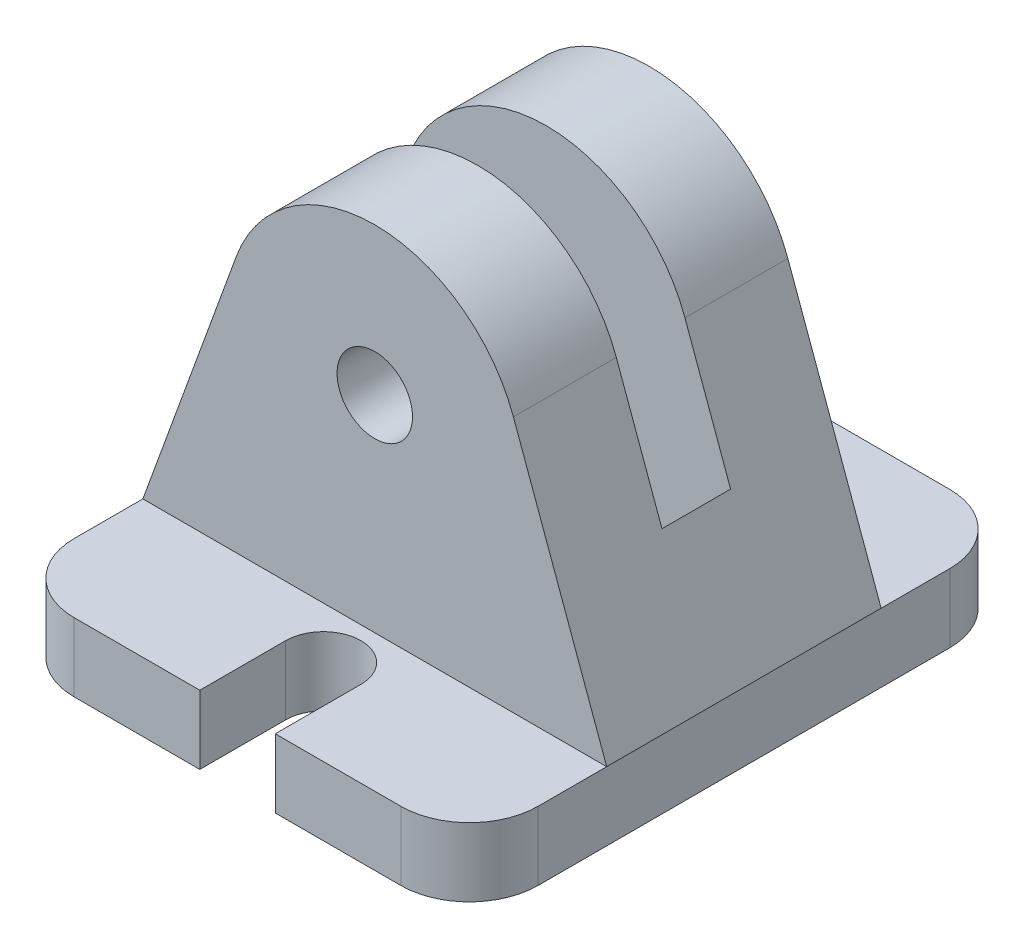
ISO-10303-21;
HEADER;
FILE_DESCRIPTION(('STEP AP214'),'2;1');
FILE_NAME('part.step','',(''),(''),'','','');
FILE_SCHEMA(('AUTOMOTIVE_DESIGN { 1 0 10303 214 1 1 1 1 }'));
ENDSEC;
DATA;
#1=APPLICATION_CONTEXT('core data for automotive mechanical design processes');
#2=APPLICATION_PROTOCOL_DEFINITION('international standard','automotive_design',2000,#1);
#3=PRODUCT_CONTEXT('',#1,'mechanical');
#4=PRODUCT('Part','Part','',(#3));
#5=PRODUCT_RELATED_PRODUCT_CATEGORY('part','',(#4));
#6=PRODUCT_DEFINITION_FORMATION('','',#4);
#7=PRODUCT_DEFINITION_CONTEXT('part definition',#1,'design');
#8=PRODUCT_DEFINITION('design','',#6,#7);
#9=PRODUCT_DEFINITION_SHAPE('','',#8);
#10=(LENGTH_UNIT() NAMED_UNIT(*) SI_UNIT(.MILLI.,.METRE.));
#11=(NAMED_UNIT(*) PLANE_ANGLE_UNIT() SI_UNIT($,.RADIAN.));
#12=(NAMED_UNIT(*) SI_UNIT($,.STERADIAN.) SOLID_ANGLE_UNIT());
#13=UNCERTAINTY_MEASURE_WITH_UNIT(LENGTH_MEASURE(1.E-05),#10,'distance_accuracy_value','');
#14=(GEOMETRIC_REPRESENTATION_CONTEXT(3) GLOBAL_UNCERTAINTY_ASSIGNED_CONTEXT((#13)) GLOBAL_UNIT_ASSIGNED_CONTEXT((#10,
#11,#12)) REPRESENTATION_CONTEXT('',''));
#15=CARTESIAN_POINT('',(0.,0.,0.));
#16=DIRECTION('',(0.,0.,1.));
#17=DIRECTION('',(1.,0.,0.));
#18=AXIS2_PLACEMENT_3D('',#15,#16,#17);
#19=CARTESIAN_POINT('',(-10.1016956734485,3.67671654075095,10.));
#20=DIRECTION('',(0.939692620785908,-0.342020143325669,0.));
#21=DIRECTION('',(0.342020143325669,0.939692620785908,0.));
#22=AXIS2_PLACEMENT_3D('',#19,#20,#21);
#23=PLANE('',#22);
#24=DIRECTION('',(0.,0.,-1.));
#25=VECTOR('',#24,1.);
#26=CARTESIAN_POINT('',(-16.8994645681091,-15.,10.));
#27=LINE('',#26,#25);
#28=CARTESIAN_POINT('',(-16.8994645681091,-15.,-2.5));
#29=VERTEX_POINT('',#28);
#30=CARTESIAN_POINT('',(-16.8994645681091,-15.,-10.));
#31=VERTEX_POINT('',#30);
#32=EDGE_CURVE('E38',#29,#31,#27,.T.);
#33=ORIENTED_EDGE('',*,*,#32,.F.);
#34=DIRECTION('',(-0.342020143325669,-0.939692620785908,0.));
#35=VECTOR('',#34,1.);
#36=CARTESIAN_POINT('',(-10.1016956734485,3.67671654075095,-2.5));
#37=LINE('',#36,#35);
#38=CARTESIAN_POINT('',(-10.1016956734485,3.67671654075095,-2.5));
#39=VERTEX_POINT('',#38);
#40=EDGE_CURVE('E259',#39,#29,#37,.T.);
#41=ORIENTED_EDGE('',*,*,#40,.F.);
#42=DIRECTION('',(0.,0.,-1.));
#43=VECTOR('',#42,1.);
#44=CARTESIAN_POINT('',(-10.1016956734485,3.67671654075095,10.));
#45=LINE('',#44,#43);
#46=CARTESIAN_POINT('',(-10.1016956734485,3.67671654075095,-10.));
#47=VERTEX_POINT('',#46);
#48=EDGE_CURVE('E299',#39,#47,#45,.T.);
#49=ORIENTED_EDGE('',*,*,#48,.T.);
#50=DIRECTION('',(-0.342020143325669,-0.939692620785908,0.));
#51=VECTOR('',#50,1.);
#52=CARTESIAN_POINT('',(-10.1016956734485,3.67671654075095,-10.));
#53=LINE('',#52,#51);
#54=EDGE_CURVE('E302',#47,#31,#53,.T.);
#55=ORIENTED_EDGE('',*,*,#54,.T.);
#56=EDGE_LOOP('',(#33,#41,#49,#55));
#57=FACE_BOUND('',#56,.T.);
#58=ADVANCED_FACE('F34',(#57),#23,.F.);
#59=CARTESIAN_POINT('',(0.,0.,-2.5));
#60=DIRECTION('',(0.,0.,1.));
#61=DIRECTION('',(1.,0.,0.));
#62=AXIS2_PLACEMENT_3D('',#59,#60,#61);
#63=CYLINDRICAL_SURFACE('',#62,14.5);
#64=DIRECTION('',(0.,0.,1.));
#65=VECTOR('',#64,1.);
#66=CARTESIAN_POINT('',(10.2530483272049,-10.253048327205,-2.5));
#67=LINE('',#66,#65);
#68=CARTESIAN_POINT('',(10.2530483272049,-10.253048327205,-2.5));
#69=VERTEX_POINT('',#68);
#70=CARTESIAN_POINT('',(10.2530483272049,-10.253048327205,2.5));
#71=VERTEX_POINT('',#70);
#72=EDGE_CURVE('E223',#69,#71,#67,.T.);
#73=ORIENTED_EDGE('',*,*,#72,.T.);
#74=CARTESIAN_POINT('',(0.,0.,2.5));
#75=DIRECTION('',(0.,0.,1.));
#76=DIRECTION('',(1.,0.,0.));
#77=AXIS2_PLACEMENT_3D('',#74,#75,#76);
#78=CIRCLE('',#77,14.5);
#79=CARTESIAN_POINT('',(13.4298082611003,-5.46719764322486,2.5));
#80=VERTEX_POINT('',#79);
#81=EDGE_CURVE('E235',#71,#80,#78,.T.);
#82=ORIENTED_EDGE('',*,*,#81,.T.);
#83=DIRECTION('',(0.,0.,1.));
#84=VECTOR('',#83,1.);
#85=CARTESIAN_POINT('',(13.4298082611003,-5.46719764322486,-2.5));
#86=LINE('',#85,#84);
#87=CARTESIAN_POINT('',(13.4298082611003,-5.46719764322486,-2.5));
#88=VERTEX_POINT('',#87);
#89=EDGE_CURVE('E232',#88,#80,#86,.T.);
#90=ORIENTED_EDGE('',*,*,#89,.F.);
#91=CARTESIAN_POINT('',(0.,0.,-2.5));
#92=DIRECTION('',(0.,0.,1.));
#93=DIRECTION('',(1.,0.,0.));
#94=AXIS2_PLACEMENT_3D('',#91,#92,#93);
#95=CIRCLE('',#94,14.5);
#96=EDGE_CURVE('E219',#69,#88,#95,.T.);
#97=ORIENTED_EDGE('',*,*,#96,.F.);
#98=EDGE_LOOP('',(#73,#82,#90,#97));
#99=FACE_BOUND('',#98,.T.);
#100=ADVANCED_FACE('F230',(#99),#63,.F.);
#101=CARTESIAN_POINT('',(-16.8994645681091,-20.,0.));
#102=DIRECTION('',(-1.,0.,0.));
#103=DIRECTION('',(0.,-1.,0.));
#104=AXIS2_PLACEMENT_3D('',#101,#102,#103);
#105=PLANE('',#104);
#106=DIRECTION('',(0.,0.,1.));
#107=VECTOR('',#106,1.);
#108=CARTESIAN_POINT('',(-16.8994645681091,-20.,0.));
#109=LINE('',#108,#107);
#110=CARTESIAN_POINT('',(-16.8994645681091,-20.,-15.));
#111=VERTEX_POINT('',#110);
#112=CARTESIAN_POINT('',(-16.8994645681091,-20.,-2.5));
#113=VERTEX_POINT('',#112);
#114=EDGE_CURVE('E407',#111,#113,#109,.T.);
#115=ORIENTED_EDGE('',*,*,#114,.T.);
#116=DIRECTION('',(0.,1.,0.));
#117=VECTOR('',#116,1.);
#118=CARTESIAN_POINT('',(-16.8994645681091,-20.,-2.5));
#119=LINE('',#118,#117);
#120=EDGE_CURVE('E367',#113,#29,#119,.T.);
#121=ORIENTED_EDGE('',*,*,#120,.T.);
#122=ORIENTED_EDGE('',*,*,#32,.T.);
#123=DIRECTION('',(0.,0.,1.));
#124=VECTOR('',#123,1.);
#125=CARTESIAN_POINT('',(-16.8994645681091,-15.,0.));
#126=LINE('',#125,#124);
#127=CARTESIAN_POINT('',(-16.8994645681091,-15.,-15.));
#128=VERTEX_POINT('',#127);
#129=EDGE_CURVE('E376',#128,#31,#126,.T.);
#130=ORIENTED_EDGE('',*,*,#129,.F.);
#131=DIRECTION('',(0.,1.,0.));
#132=VECTOR('',#131,1.);
#133=CARTESIAN_POINT('',(-16.8994645681091,-20.,-15.));
#134=LINE('',#133,#132);
#135=EDGE_CURVE('E471',#111,#128,#134,.T.);
#136=ORIENTED_EDGE('',*,*,#135,.F.);
#137=EDGE_LOOP('',(#115,#121,#122,#130,#136));
#138=FACE_BOUND('',#137,.T.);
#139=ADVANCED_FACE('F343',(#138),#105,.T.);
#140=CARTESIAN_POINT('',(0.,-20.,0.));
#141=DIRECTION('',(0.,-1.,0.));
#142=DIRECTION('',(1.,0.,0.));
#143=AXIS2_PLACEMENT_3D('',#140,#141,#142);
#144=PLANE('',#143);
#145=DIRECTION('',(0.,0.,1.));
#146=VECTOR('',#145,1.);
#147=CARTESIAN_POINT('',(0.506096654409785,-20.,0.));
#148=LINE('',#147,#146);
#149=CARTESIAN_POINT('',(0.506096654409784,-20.,-2.5));
#150=VERTEX_POINT('',#149);
#151=CARTESIAN_POINT('',(0.506096654409784,-20.,2.5));
#152=VERTEX_POINT('',#151);
#153=EDGE_CURVE('E44',#150,#152,#148,.T.);
#154=ORIENTED_EDGE('',*,*,#153,.F.);
#155=DIRECTION('',(-1.,0.,0.));
#156=VECTOR('',#155,1.);
#157=CARTESIAN_POINT('',(0.,-20.,-2.5));
#158=LINE('',#157,#156);
#159=EDGE_CURVE('E11',#150,#113,#158,.T.);
#160=ORIENTED_EDGE('',*,*,#159,.T.);
#161=ORIENTED_EDGE('',*,*,#114,.F.);
#162=CARTESIAN_POINT('',(-11.8994645681091,-20.,-15.));
#163=DIRECTION('',(0.,-1.,0.));
#164=DIRECTION('',(1.,0.,0.));
#165=AXIS2_PLACEMENT_3D('',#162,#163,#164);
#166=CIRCLE('',#165,5.);
#167=CARTESIAN_POINT('',(-11.8994645681091,-20.,-20.));
#168=VERTEX_POINT('',#167);
#169=EDGE_CURVE('E410',#111,#168,#166,.T.);
#170=ORIENTED_EDGE('',*,*,#169,.T.);
#171=DIRECTION('',(1.,0.,0.));
#172=VECTOR('',#171,1.);
#173=CARTESIAN_POINT('',(0.,-20.,-20.));
#174=LINE('',#173,#172);
#175=CARTESIAN_POINT('',(-2.75,-20.,-20.));
#176=VERTEX_POINT('',#175);
#177=EDGE_CURVE('E417',#168,#176,#174,.T.);
#178=ORIENTED_EDGE('',*,*,#177,.T.);
#179=DIRECTION('',(0.,0.,-1.));
#180=VECTOR('',#179,1.);
#181=CARTESIAN_POINT('',(-2.75,-20.,-20.));
#182=LINE('',#181,#180);
#183=CARTESIAN_POINT('',(-2.75,-20.,-13.75));
#184=VERTEX_POINT('',#183);
#185=EDGE_CURVE('E617',#184,#176,#182,.T.);
#186=ORIENTED_EDGE('',*,*,#185,.F.);
#187=CARTESIAN_POINT('',(0.,-20.,-13.75));
#188=DIRECTION('',(0.,-1.,0.));
#189=DIRECTION('',(-1.,0.,0.));
#190=AXIS2_PLACEMENT_3D('',#187,#188,#189);
#191=CIRCLE('',#190,2.75);
#192=CARTESIAN_POINT('',(2.75,-20.,-13.75));
#193=VERTEX_POINT('',#192);
#194=EDGE_CURVE('E59',#193,#184,#191,.T.);
#195=ORIENTED_EDGE('',*,*,#194,.F.);
#196=DIRECTION('',(0.,0.,1.));
#197=VECTOR('',#196,1.);
#198=CARTESIAN_POINT('',(2.75,-20.,-13.75));
#199=LINE('',#198,#197);
#200=CARTESIAN_POINT('',(2.75,-20.,-20.));
#201=VERTEX_POINT('',#200);
#202=EDGE_CURVE('E521',#201,#193,#199,.T.);
#203=ORIENTED_EDGE('',*,*,#202,.F.);
#204=CARTESIAN_POINT('',(11.8994645681091,-20.,-20.));
#205=VERTEX_POINT('',#204);
#206=EDGE_CURVE('E416',#201,#205,#174,.T.);
#207=ORIENTED_EDGE('',*,*,#206,.T.);
#208=CARTESIAN_POINT('',(11.8994645681091,-20.,-15.));
#209=DIRECTION('',(0.,-1.,0.));
#210=DIRECTION('',(1.,0.,0.));
#211=AXIS2_PLACEMENT_3D('',#208,#209,#210);
#212=CIRCLE('',#211,5.);
#213=CARTESIAN_POINT('',(16.8994645681091,-20.,-15.));
#214=VERTEX_POINT('',#213);
#215=EDGE_CURVE('E420',#205,#214,#212,.T.);
#216=ORIENTED_EDGE('',*,*,#215,.T.);
#217=DIRECTION('',(0.,0.,1.));
#218=VECTOR('',#217,1.);
#219=CARTESIAN_POINT('',(16.8994645681091,-20.,0.));
#220=LINE('',#219,#218);
#221=CARTESIAN_POINT('',(16.8994645681091,-20.,15.));
#222=VERTEX_POINT('',#221);
#223=EDGE_CURVE('E422',#214,#222,#220,.T.);
#224=ORIENTED_EDGE('',*,*,#223,.T.);
#225=CARTESIAN_POINT('',(11.8994645681091,-20.,15.));
#226=DIRECTION('',(0.,-1.,0.));
#227=DIRECTION('',(1.,0.,0.));
#228=AXIS2_PLACEMENT_3D('',#225,#226,#227);
#229=CIRCLE('',#228,5.);
#230=CARTESIAN_POINT('',(11.8994645681091,-20.,20.));
#231=VERTEX_POINT('',#230);
#232=EDGE_CURVE('E424',#231,#222,#229,.F.);
#233=ORIENTED_EDGE('',*,*,#232,.F.);
#234=DIRECTION('',(1.,0.,0.));
#235=VECTOR('',#234,1.);
#236=CARTESIAN_POINT('',(0.,-20.,20.));
#237=LINE('',#236,#235);
#238=CARTESIAN_POINT('',(2.75,-20.,20.));
#239=VERTEX_POINT('',#238);
#240=EDGE_CURVE('E427',#239,#231,#237,.T.);
#241=ORIENTED_EDGE('',*,*,#240,.F.);
#242=DIRECTION('',(0.,0.,1.));
#243=VECTOR('',#242,1.);
#244=CARTESIAN_POINT('',(2.75,-20.,13.75));
#245=LINE('',#244,#243);
#246=CARTESIAN_POINT('',(2.75,-20.,13.75));
#247=VERTEX_POINT('',#246);
#248=EDGE_CURVE('E539',#247,#239,#245,.T.);
#249=ORIENTED_EDGE('',*,*,#248,.F.);
#250=CARTESIAN_POINT('',(0.,-20.,13.75));
#251=DIRECTION('',(0.,-1.,0.));
#252=DIRECTION('',(1.,0.,0.));
#253=AXIS2_PLACEMENT_3D('',#250,#251,#252);
#254=CIRCLE('',#253,2.75);
#255=CARTESIAN_POINT('',(-2.75,-20.,13.75));
#256=VERTEX_POINT('',#255);
#257=EDGE_CURVE('E536',#256,#247,#254,.T.);
#258=ORIENTED_EDGE('',*,*,#257,.F.);
#259=DIRECTION('',(0.,0.,-1.));
#260=VECTOR('',#259,1.);
#261=CARTESIAN_POINT('',(-2.75,-20.,20.));
#262=LINE('',#261,#260);
#263=CARTESIAN_POINT('',(-2.75,-20.,20.));
#264=VERTEX_POINT('',#263);
#265=EDGE_CURVE('E533',#264,#256,#262,.T.);
#266=ORIENTED_EDGE('',*,*,#265,.F.);
#267=CARTESIAN_POINT('',(-11.8994645681091,-20.,20.));
#268=VERTEX_POINT('',#267);
#269=EDGE_CURVE('E428',#268,#264,#237,.T.);
#270=ORIENTED_EDGE('',*,*,#269,.F.);
#271=CARTESIAN_POINT('',(-11.8994645681091,-20.,15.));
#272=DIRECTION('',(0.,-1.,0.));
#273=DIRECTION('',(1.,0.,0.));
#274=AXIS2_PLACEMENT_3D('',#271,#272,#273);
#275=CIRCLE('',#274,5.);
#276=CARTESIAN_POINT('',(-16.8994645681091,-20.,15.));
#277=VERTEX_POINT('',#276);
#278=EDGE_CURVE('E406',#277,#268,#275,.F.);
#279=ORIENTED_EDGE('',*,*,#278,.F.);
#280=CARTESIAN_POINT('',(-16.8994645681091,-20.,2.5));
#281=VERTEX_POINT('',#280);
#282=EDGE_CURVE('E403',#281,#277,#109,.T.);
#283=ORIENTED_EDGE('',*,*,#282,.F.);
#284=DIRECTION('',(-1.,0.,0.));
#285=VECTOR('',#284,1.);
#286=CARTESIAN_POINT('',(0.,-20.,2.5));
#287=LINE('',#286,#285);
#288=EDGE_CURVE('E364',#152,#281,#287,.T.);
#289=ORIENTED_EDGE('',*,*,#288,.F.);
#290=EDGE_LOOP('',(#154,#160,#161,#170,#178,#186,#195,#203,#207,#216,#224,#233,#241,#249,#258,
#266,#270,#279,#283,#289));
#291=FACE_BOUND('',#290,.T.);
#292=ADVANCED_FACE('F401',(#291),#144,.T.);
#293=CARTESIAN_POINT('',(0.,-20.,-20.));
#294=DIRECTION('',(0.,0.,1.));
#295=DIRECTION('',(1.,0.,0.));
#296=AXIS2_PLACEMENT_3D('',#293,#294,#295);
#297=PLANE('',#296);
#298=ORIENTED_EDGE('',*,*,#206,.F.);
#299=DIRECTION('',(0.,-1.,0.));
#300=VECTOR('',#299,1.);
#301=CARTESIAN_POINT('',(2.75,10.75,-20.));
#302=LINE('',#301,#300);
#303=CARTESIAN_POINT('',(2.75,-15.,-20.));
#304=VERTEX_POINT('',#303);
#305=EDGE_CURVE('E516',#304,#201,#302,.T.);
#306=ORIENTED_EDGE('',*,*,#305,.F.);
#307=DIRECTION('',(1.,0.,0.));
#308=VECTOR('',#307,1.);
#309=CARTESIAN_POINT('',(0.,-15.,-20.));
#310=LINE('',#309,#308);
#311=CARTESIAN_POINT('',(11.8994645681091,-15.,-20.));
#312=VERTEX_POINT('',#311);
#313=EDGE_CURVE('E486',#304,#312,#310,.T.);
#314=ORIENTED_EDGE('',*,*,#313,.T.);
#315=DIRECTION('',(0.,1.,0.));
#316=VECTOR('',#315,1.);
#317=CARTESIAN_POINT('',(11.8994645681091,-20.,-20.));
#318=LINE('',#317,#316);
#319=EDGE_CURVE('E465',#205,#312,#318,.T.);
#320=ORIENTED_EDGE('',*,*,#319,.F.);
#321=EDGE_LOOP('',(#298,#306,#314,#320));
#322=FACE_BOUND('',#321,.T.);
#323=ADVANCED_FACE('F588',(#322),#297,.F.);
#324=CARTESIAN_POINT('',(0.,-20.,20.));
#325=DIRECTION('',(0.,0.,1.));
#326=DIRECTION('',(1.,0.,0.));
#327=AXIS2_PLACEMENT_3D('',#324,#325,#326);
#328=PLANE('',#327);
#329=DIRECTION('',(0.,-1.,0.));
#330=VECTOR('',#329,1.);
#331=CARTESIAN_POINT('',(2.75,10.75,20.));
#332=LINE('',#331,#330);
#333=CARTESIAN_POINT('',(2.75,-15.,20.));
#334=VERTEX_POINT('',#333);
#335=EDGE_CURVE('E432',#334,#239,#332,.T.);
#336=ORIENTED_EDGE('',*,*,#335,.T.);
#337=ORIENTED_EDGE('',*,*,#240,.T.);
#338=DIRECTION('',(0.,1.,0.));
#339=VECTOR('',#338,1.);
#340=CARTESIAN_POINT('',(11.8994645681091,-20.,20.));
#341=LINE('',#340,#339);
#342=CARTESIAN_POINT('',(11.8994645681091,-15.,20.));
#343=VERTEX_POINT('',#342);
#344=EDGE_CURVE('E456',#231,#343,#341,.T.);
#345=ORIENTED_EDGE('',*,*,#344,.T.);
#346=DIRECTION('',(1.,0.,0.));
#347=VECTOR('',#346,1.);
#348=CARTESIAN_POINT('',(0.,-15.,20.));
#349=LINE('',#348,#347);
#350=EDGE_CURVE('E453',#334,#343,#349,.T.);
#351=ORIENTED_EDGE('',*,*,#350,.F.);
#352=EDGE_LOOP('',(#336,#337,#345,#351));
#353=FACE_BOUND('',#352,.T.);
#354=ADVANCED_FACE('F357',(#353),#328,.T.);
#355=CARTESIAN_POINT('',(0.,0.,10.));
#356=DIRECTION('',(0.,0.,-1.));
#357=DIRECTION('',(-1.,0.,0.));
#358=AXIS2_PLACEMENT_3D('',#355,#356,#357);
#359=CYLINDRICAL_SURFACE('',#358,10.75);
#360=CARTESIAN_POINT('',(0.,0.,-2.5));
#361=DIRECTION('',(0.,0.,1.));
#362=DIRECTION('',(1.,0.,0.));
#363=AXIS2_PLACEMENT_3D('',#360,#361,#362);
#364=CIRCLE('',#363,10.75);
#365=CARTESIAN_POINT('',(10.1016956734485,3.67671654075095,-2.5));
#366=VERTEX_POINT('',#365);
#367=EDGE_CURVE('E257',#366,#39,#364,.T.);
#368=ORIENTED_EDGE('',*,*,#367,.F.);
#369=DIRECTION('',(0.,0.,-1.));
#370=VECTOR('',#369,1.);
#371=CARTESIAN_POINT('',(10.1016956734485,3.67671654075095,10.));
#372=LINE('',#371,#370);
#373=CARTESIAN_POINT('',(10.1016956734485,3.67671654075095,-10.));
#374=VERTEX_POINT('',#373);
#375=EDGE_CURVE('E290',#366,#374,#372,.T.);
#376=ORIENTED_EDGE('',*,*,#375,.T.);
#377=CARTESIAN_POINT('',(0.,0.,-10.));
#378=DIRECTION('',(0.,0.,1.));
#379=DIRECTION('',(1.,0.,0.));
#380=AXIS2_PLACEMENT_3D('',#377,#378,#379);
#381=CIRCLE('',#380,10.75);
#382=EDGE_CURVE('E265',#374,#47,#381,.T.);
#383=ORIENTED_EDGE('',*,*,#382,.T.);
#384=ORIENTED_EDGE('',*,*,#48,.F.);
#385=EDGE_LOOP('',(#368,#376,#383,#384));
#386=FACE_BOUND('',#385,.T.);
#387=ADVANCED_FACE('F349',(#386),#359,.T.);
#388=DIRECTION('',(-0.342020143325669,-0.939692620785908,0.));
#389=VECTOR('',#388,1.);
#390=CARTESIAN_POINT('',(-10.1016956734485,3.67671654075095,2.5));
#391=LINE('',#390,#389);
#392=CARTESIAN_POINT('',(-10.1016956734485,3.67671654075095,2.5));
#393=VERTEX_POINT('',#392);
#394=CARTESIAN_POINT('',(-16.8994645681091,-15.,2.5));
#395=VERTEX_POINT('',#394);
#396=EDGE_CURVE('E252',#393,#395,#391,.T.);
#397=ORIENTED_EDGE('',*,*,#396,.T.);
#398=CARTESIAN_POINT('',(-16.8994645681091,-15.,10.));
#399=VERTEX_POINT('',#398);
#400=EDGE_CURVE('E297',#399,#395,#27,.T.);
#401=ORIENTED_EDGE('',*,*,#400,.F.);
#402=DIRECTION('',(-0.342020143325669,-0.939692620785908,0.));
#403=VECTOR('',#402,1.);
#404=CARTESIAN_POINT('',(-10.1016956734485,3.67671654075095,10.));
#405=LINE('',#404,#403);
#406=CARTESIAN_POINT('',(-10.1016956734485,3.67671654075095,10.));
#407=VERTEX_POINT('',#406);
#408=EDGE_CURVE('E271',#407,#399,#405,.T.);
#409=ORIENTED_EDGE('',*,*,#408,.F.);
#410=EDGE_CURVE('E315',#407,#393,#45,.T.);
#411=ORIENTED_EDGE('',*,*,#410,.T.);
#412=EDGE_LOOP('',(#397,#401,#409,#411));
#413=FACE_BOUND('',#412,.T.);
#414=ADVANCED_FACE('F339',(#413),#23,.F.);
#415=CARTESIAN_POINT('',(16.8994645681091,-15.,10.));
#416=DIRECTION('',(-0.939692620785908,-0.34202014332567,0.));
#417=DIRECTION('',(0.34202014332567,-0.939692620785908,0.));
#418=AXIS2_PLACEMENT_3D('',#415,#416,#417);
#419=PLANE('',#418);
#420=DIRECTION('',(-0.34202014332567,0.939692620785908,0.));
#421=VECTOR('',#420,1.);
#422=CARTESIAN_POINT('',(16.8994645681091,-15.,-2.5));
#423=LINE('',#422,#421);
#424=EDGE_CURVE('E255',#88,#366,#423,.T.);
#425=ORIENTED_EDGE('',*,*,#424,.F.);
#426=ORIENTED_EDGE('',*,*,#89,.T.);
#427=DIRECTION('',(-0.34202014332567,0.939692620785908,0.));
#428=VECTOR('',#427,1.);
#429=CARTESIAN_POINT('',(16.8994645681091,-15.,2.5));
#430=LINE('',#429,#428);
#431=CARTESIAN_POINT('',(10.1016956734485,3.67671654075095,2.5));
#432=VERTEX_POINT('',#431);
#433=EDGE_CURVE('E238',#80,#432,#430,.T.);
#434=ORIENTED_EDGE('',*,*,#433,.T.);
#435=CARTESIAN_POINT('',(10.1016956734485,3.67671654075095,10.));
#436=VERTEX_POINT('',#435);
#437=EDGE_CURVE('E286',#436,#432,#372,.T.);
#438=ORIENTED_EDGE('',*,*,#437,.F.);
#439=DIRECTION('',(-0.34202014332567,0.939692620785908,0.));
#440=VECTOR('',#439,1.);
#441=CARTESIAN_POINT('',(16.8994645681091,-15.,10.));
#442=LINE('',#441,#440);
#443=CARTESIAN_POINT('',(16.8994645681091,-15.,10.));
#444=VERTEX_POINT('',#443);
#445=EDGE_CURVE('E281',#444,#436,#442,.T.);
#446=ORIENTED_EDGE('',*,*,#445,.F.);
#447=DIRECTION('',(0.,0.,-1.));
#448=VECTOR('',#447,1.);
#449=CARTESIAN_POINT('',(16.8994645681091,-15.,10.));
#450=LINE('',#449,#448);
#451=CARTESIAN_POINT('',(16.8994645681091,-15.,-10.));
#452=VERTEX_POINT('',#451);
#453=EDGE_CURVE('E283',#444,#452,#450,.T.);
#454=ORIENTED_EDGE('',*,*,#453,.T.);
#455=DIRECTION('',(-0.34202014332567,0.939692620785908,0.));
#456=VECTOR('',#455,1.);
#457=CARTESIAN_POINT('',(16.8994645681091,-15.,-10.));
#458=LINE('',#457,#456);
#459=EDGE_CURVE('E272',#452,#374,#458,.T.);
#460=ORIENTED_EDGE('',*,*,#459,.T.);
#461=ORIENTED_EDGE('',*,*,#375,.F.);
#462=EDGE_LOOP('',(#425,#426,#434,#438,#446,#454,#460,#461));
#463=FACE_BOUND('',#462,.T.);
#464=ADVANCED_FACE('F348',(#463),#419,.F.);
#465=CARTESIAN_POINT('',(0.,0.,10.));
#466=DIRECTION('',(0.,0.,-1.));
#467=DIRECTION('',(-1.,0.,0.));
#468=AXIS2_PLACEMENT_3D('',#465,#466,#467);
#469=CYLINDRICAL_SURFACE('',#468,2.75);
#470=CARTESIAN_POINT('',(0.,0.,-10.));
#471=DIRECTION('',(0.,0.,1.));
#472=DIRECTION('',(1.,0.,0.));
#473=AXIS2_PLACEMENT_3D('',#470,#471,#472);
#474=CIRCLE('',#473,2.75);
#475=CARTESIAN_POINT('',(2.75,0.,-10.));
#476=VERTEX_POINT('',#475);
#477=EDGE_CURVE('E261',#476,#476,#474,.T.);
#478=ORIENTED_EDGE('',*,*,#477,.F.);
#479=EDGE_LOOP('',(#478));
#480=FACE_BOUND('',#479,.T.);
#481=CARTESIAN_POINT('',(0.,0.,-2.5));
#482=DIRECTION('',(0.,0.,1.));
#483=DIRECTION('',(1.,0.,0.));
#484=AXIS2_PLACEMENT_3D('',#481,#482,#483);
#485=CIRCLE('',#484,2.75);
#486=CARTESIAN_POINT('',(2.75,0.,-2.5));
#487=VERTEX_POINT('',#486);
#488=EDGE_CURVE('E254',#487,#487,#485,.T.);
#489=ORIENTED_EDGE('',*,*,#488,.T.);
#490=EDGE_LOOP('',(#489));
#491=FACE_BOUND('',#490,.T.);
#492=ADVANCED_FACE('F320',(#480,#491),#469,.F.);
#493=CARTESIAN_POINT('',(0.,0.,10.));
#494=DIRECTION('',(0.,0.,1.));
#495=DIRECTION('',(1.,0.,0.));
#496=AXIS2_PLACEMENT_3D('',#493,#494,#495);
#497=PLANE('',#496);
#498=CARTESIAN_POINT('',(0.,0.,10.));
#499=DIRECTION('',(0.,0.,1.));
#500=DIRECTION('',(1.,0.,0.));
#501=AXIS2_PLACEMENT_3D('',#498,#499,#500);
#502=CIRCLE('',#501,10.75);
#503=EDGE_CURVE('E268',#436,#407,#502,.T.);
#504=ORIENTED_EDGE('',*,*,#503,.T.);
#505=ORIENTED_EDGE('',*,*,#408,.T.);
#506=DIRECTION('',(1.,0.,0.));
#507=VECTOR('',#506,1.);
#508=CARTESIAN_POINT('',(-16.8994645681091,-15.,10.));
#509=LINE('',#508,#507);
#510=EDGE_CURVE('E277',#399,#444,#509,.T.);
#511=ORIENTED_EDGE('',*,*,#510,.T.);
#512=ORIENTED_EDGE('',*,*,#445,.T.);
#513=EDGE_LOOP('',(#504,#505,#511,#512));
#514=FACE_BOUND('',#513,.T.);
#515=CARTESIAN_POINT('',(0.,0.,10.));
#516=DIRECTION('',(0.,0.,1.));
#517=DIRECTION('',(1.,0.,0.));
#518=AXIS2_PLACEMENT_3D('',#515,#516,#517);
#519=CIRCLE('',#518,2.75);
#520=CARTESIAN_POINT('',(2.75,0.,10.));
#521=VERTEX_POINT('',#520);
#522=EDGE_CURVE('E262',#521,#521,#519,.T.);
#523=ORIENTED_EDGE('',*,*,#522,.F.);
#524=EDGE_LOOP('',(#523));
#525=FACE_BOUND('',#524,.T.);
#526=ADVANCED_FACE('F379',(#514,#525),#497,.T.);
#527=CARTESIAN_POINT('',(0.,0.,-10.));
#528=DIRECTION('',(0.,0.,1.));
#529=DIRECTION('',(1.,0.,0.));
#530=AXIS2_PLACEMENT_3D('',#527,#528,#529);
#531=PLANE('',#530);
#532=ORIENTED_EDGE('',*,*,#382,.F.);
#533=ORIENTED_EDGE('',*,*,#459,.F.);
#534=DIRECTION('',(1.,0.,0.));
#535=VECTOR('',#534,1.);
#536=CARTESIAN_POINT('',(-16.8994645681091,-15.,-10.));
#537=LINE('',#536,#535);
#538=EDGE_CURVE('E306',#31,#452,#537,.T.);
#539=ORIENTED_EDGE('',*,*,#538,.F.);
#540=ORIENTED_EDGE('',*,*,#54,.F.);
#541=EDGE_LOOP('',(#532,#533,#539,#540));
#542=FACE_BOUND('',#541,.T.);
#543=ORIENTED_EDGE('',*,*,#477,.T.);
#544=EDGE_LOOP('',(#543));
#545=FACE_BOUND('',#544,.T.);
#546=ADVANCED_FACE('F496',(#542,#545),#531,.F.);
#547=ORIENTED_EDGE('',*,*,#437,.T.);
#548=CARTESIAN_POINT('',(0.,0.,2.5));
#549=DIRECTION('',(0.,0.,1.));
#550=DIRECTION('',(1.,0.,0.));
#551=AXIS2_PLACEMENT_3D('',#548,#549,#550);
#552=CIRCLE('',#551,10.75);
#553=EDGE_CURVE('E249',#432,#393,#552,.T.);
#554=ORIENTED_EDGE('',*,*,#553,.T.);
#555=ORIENTED_EDGE('',*,*,#410,.F.);
#556=ORIENTED_EDGE('',*,*,#503,.F.);
#557=EDGE_LOOP('',(#547,#554,#555,#556));
#558=FACE_BOUND('',#557,.T.);
#559=ADVANCED_FACE('F36',(#558),#359,.T.);
#560=CARTESIAN_POINT('',(0.,0.,2.5));
#561=DIRECTION('',(0.,0.,1.));
#562=DIRECTION('',(1.,0.,0.));
#563=AXIS2_PLACEMENT_3D('',#560,#561,#562);
#564=CIRCLE('',#563,2.75);
#565=CARTESIAN_POINT('',(2.75,0.,2.5));
#566=VERTEX_POINT('',#565);
#567=EDGE_CURVE('E234',#566,#566,#564,.T.);
#568=ORIENTED_EDGE('',*,*,#567,.F.);
#569=EDGE_LOOP('',(#568));
#570=FACE_BOUND('',#569,.T.);
#571=ORIENTED_EDGE('',*,*,#522,.T.);
#572=EDGE_LOOP('',(#571));
#573=FACE_BOUND('',#572,.T.);
#574=ADVANCED_FACE('F324',(#570,#573),#469,.F.);
#575=CARTESIAN_POINT('',(0.,0.,-2.5));
#576=DIRECTION('',(0.,0.,1.));
#577=DIRECTION('',(1.,0.,0.));
#578=AXIS2_PLACEMENT_3D('',#575,#576,#577);
#579=PLANE('',#578);
#580=ORIENTED_EDGE('',*,*,#488,.F.);
#581=EDGE_LOOP('',(#580));
#582=FACE_BOUND('',#581,.T.);
#583=ORIENTED_EDGE('',*,*,#40,.T.);
#584=ORIENTED_EDGE('',*,*,#120,.F.);
#585=ORIENTED_EDGE('',*,*,#159,.F.);
#586=DIRECTION('',(0.707106781186551,0.707106781186544,0.));
#587=VECTOR('',#586,1.);
#588=CARTESIAN_POINT('',(10.2530483272049,-10.253048327205,-2.5));
#589=LINE('',#588,#587);
#590=EDGE_CURVE('E215',#150,#69,#589,.T.);
#591=ORIENTED_EDGE('',*,*,#590,.T.);
#592=ORIENTED_EDGE('',*,*,#96,.T.);
#593=ORIENTED_EDGE('',*,*,#424,.T.);
#594=ORIENTED_EDGE('',*,*,#367,.T.);
#595=EDGE_LOOP('',(#583,#584,#585,#591,#592,#593,#594));
#596=FACE_BOUND('',#595,.T.);
#597=ADVANCED_FACE('F217',(#582,#596),#579,.T.);
#598=CARTESIAN_POINT('',(0.,0.,2.5));
#599=DIRECTION('',(0.,0.,1.));
#600=DIRECTION('',(1.,0.,0.));
#601=AXIS2_PLACEMENT_3D('',#598,#599,#600);
#602=PLANE('',#601);
#603=ORIENTED_EDGE('',*,*,#567,.T.);
#604=EDGE_LOOP('',(#603));
#605=FACE_BOUND('',#604,.T.);
#606=ORIENTED_EDGE('',*,*,#553,.F.);
#607=ORIENTED_EDGE('',*,*,#433,.F.);
#608=ORIENTED_EDGE('',*,*,#81,.F.);
#609=DIRECTION('',(0.707106781186551,0.707106781186544,0.));
#610=VECTOR('',#609,1.);
#611=CARTESIAN_POINT('',(10.2530483272049,-10.253048327205,2.5));
#612=LINE('',#611,#610);
#613=EDGE_CURVE('E51',#152,#71,#612,.T.);
#614=ORIENTED_EDGE('',*,*,#613,.F.);
#615=ORIENTED_EDGE('',*,*,#288,.T.);
#616=DIRECTION('',(0.,1.,0.));
#617=VECTOR('',#616,1.);
#618=CARTESIAN_POINT('',(-16.8994645681091,-20.,2.5));
#619=LINE('',#618,#617);
#620=EDGE_CURVE('E228',#281,#395,#619,.T.);
#621=ORIENTED_EDGE('',*,*,#620,.T.);
#622=ORIENTED_EDGE('',*,*,#396,.F.);
#623=EDGE_LOOP('',(#606,#607,#608,#614,#615,#621,#622));
#624=FACE_BOUND('',#623,.T.);
#625=ADVANCED_FACE('F323',(#605,#624),#602,.F.);
#626=CARTESIAN_POINT('',(0.,-15.,0.));
#627=DIRECTION('',(0.,-1.,0.));
#628=DIRECTION('',(1.,0.,0.));
#629=AXIS2_PLACEMENT_3D('',#626,#627,#628);
#630=PLANE('',#629);
#631=ORIENTED_EDGE('',*,*,#313,.F.);
#632=DIRECTION('',(0.,0.,1.));
#633=VECTOR('',#632,1.);
#634=CARTESIAN_POINT('',(2.75,-15.,0.));
#635=LINE('',#634,#633);
#636=CARTESIAN_POINT('',(2.75,-15.,-13.75));
#637=VERTEX_POINT('',#636);
#638=EDGE_CURVE('E527',#304,#637,#635,.T.);
#639=ORIENTED_EDGE('',*,*,#638,.T.);
#640=CARTESIAN_POINT('',(0.,-15.,-13.75));
#641=DIRECTION('',(0.,-1.,0.));
#642=DIRECTION('',(1.,0.,0.));
#643=AXIS2_PLACEMENT_3D('',#640,#641,#642);
#644=CIRCLE('',#643,2.75);
#645=CARTESIAN_POINT('',(-2.75,-15.,-13.75));
#646=VERTEX_POINT('',#645);
#647=EDGE_CURVE('E530',#637,#646,#644,.T.);
#648=ORIENTED_EDGE('',*,*,#647,.T.);
#649=DIRECTION('',(0.,0.,-1.));
#650=VECTOR('',#649,1.);
#651=CARTESIAN_POINT('',(-2.75,-15.,0.));
#652=LINE('',#651,#650);
#653=CARTESIAN_POINT('',(-2.75,-15.,-20.));
#654=VERTEX_POINT('',#653);
#655=EDGE_CURVE('E525',#646,#654,#652,.T.);
#656=ORIENTED_EDGE('',*,*,#655,.T.);
#657=CARTESIAN_POINT('',(-11.8994645681091,-15.,-20.));
#658=VERTEX_POINT('',#657);
#659=EDGE_CURVE('E485',#658,#654,#310,.T.);
#660=ORIENTED_EDGE('',*,*,#659,.F.);
#661=CARTESIAN_POINT('',(-11.8994645681091,-15.,-15.));
#662=DIRECTION('',(0.,-1.,0.));
#663=DIRECTION('',(1.,0.,0.));
#664=AXIS2_PLACEMENT_3D('',#661,#662,#663);
#665=CIRCLE('',#664,5.);
#666=EDGE_CURVE('E435',#128,#658,#665,.T.);
#667=ORIENTED_EDGE('',*,*,#666,.F.);
#668=ORIENTED_EDGE('',*,*,#129,.T.);
#669=ORIENTED_EDGE('',*,*,#538,.T.);
#670=DIRECTION('',(0.,0.,1.));
#671=VECTOR('',#670,1.);
#672=CARTESIAN_POINT('',(16.8994645681091,-15.,0.));
#673=LINE('',#672,#671);
#674=CARTESIAN_POINT('',(16.8994645681091,-15.,-15.));
#675=VERTEX_POINT('',#674);
#676=EDGE_CURVE('E443',#675,#452,#673,.T.);
#677=ORIENTED_EDGE('',*,*,#676,.F.);
#678=CARTESIAN_POINT('',(11.8994645681091,-15.,-15.));
#679=DIRECTION('',(0.,-1.,0.));
#680=DIRECTION('',(1.,0.,0.));
#681=AXIS2_PLACEMENT_3D('',#678,#679,#680);
#682=CIRCLE('',#681,5.);
#683=EDGE_CURVE('E444',#312,#675,#682,.T.);
#684=ORIENTED_EDGE('',*,*,#683,.F.);
#685=EDGE_LOOP('',(#631,#639,#648,#656,#660,#667,#668,#669,#677,#684));
#686=FACE_BOUND('',#685,.T.);
#687=ADVANCED_FACE('F330',(#686),#630,.F.);
#688=CARTESIAN_POINT('',(-11.8994645681091,-20.,15.));
#689=DIRECTION('',(0.,1.,0.));
#690=DIRECTION('',(-1.,0.,0.));
#691=AXIS2_PLACEMENT_3D('',#688,#689,#690);
#692=CYLINDRICAL_SURFACE('',#691,5.);
#693=CARTESIAN_POINT('',(-11.8994645681091,-15.,15.));
#694=DIRECTION('',(0.,-1.,0.));
#695=DIRECTION('',(1.,0.,0.));
#696=AXIS2_PLACEMENT_3D('',#693,#694,#695);
#697=CIRCLE('',#696,5.);
#698=CARTESIAN_POINT('',(-16.8994645681091,-15.,15.));
#699=VERTEX_POINT('',#698);
#700=CARTESIAN_POINT('',(-11.8994645681091,-15.,20.));
#701=VERTEX_POINT('',#700);
#702=EDGE_CURVE('E377',#699,#701,#697,.F.);
#703=ORIENTED_EDGE('',*,*,#702,.F.);
#704=DIRECTION('',(0.,1.,0.));
#705=VECTOR('',#704,1.);
#706=CARTESIAN_POINT('',(-16.8994645681091,-20.,15.));
#707=LINE('',#706,#705);
#708=EDGE_CURVE('E240',#277,#699,#707,.T.);
#709=ORIENTED_EDGE('',*,*,#708,.F.);
#710=ORIENTED_EDGE('',*,*,#278,.T.);
#711=DIRECTION('',(0.,1.,0.));
#712=VECTOR('',#711,1.);
#713=CARTESIAN_POINT('',(-11.8994645681091,-20.,20.));
#714=LINE('',#713,#712);
#715=EDGE_CURVE('E431',#268,#701,#714,.T.);
#716=ORIENTED_EDGE('',*,*,#715,.T.);
#717=EDGE_LOOP('',(#703,#709,#710,#716));
#718=FACE_BOUND('',#717,.T.);
#719=ADVANCED_FACE('F557',(#718),#692,.T.);
#720=ORIENTED_EDGE('',*,*,#620,.F.);
#721=ORIENTED_EDGE('',*,*,#282,.T.);
#722=ORIENTED_EDGE('',*,*,#708,.T.);
#723=EDGE_CURVE('E243',#399,#699,#126,.T.);
#724=ORIENTED_EDGE('',*,*,#723,.F.);
#725=ORIENTED_EDGE('',*,*,#400,.T.);
#726=EDGE_LOOP('',(#720,#721,#722,#724,#725));
#727=FACE_BOUND('',#726,.T.);
#728=ADVANCED_FACE('F370',(#727),#105,.T.);
#729=CARTESIAN_POINT('',(-11.8994645681091,-20.,-15.));
#730=DIRECTION('',(0.,1.,0.));
#731=DIRECTION('',(-1.,0.,0.));
#732=AXIS2_PLACEMENT_3D('',#729,#730,#731);
#733=CYLINDRICAL_SURFACE('',#732,5.);
#734=ORIENTED_EDGE('',*,*,#666,.T.);
#735=DIRECTION('',(0.,1.,0.));
#736=VECTOR('',#735,1.);
#737=CARTESIAN_POINT('',(-11.8994645681091,-20.,-20.));
#738=LINE('',#737,#736);
#739=EDGE_CURVE('E468',#168,#658,#738,.T.);
#740=ORIENTED_EDGE('',*,*,#739,.F.);
#741=ORIENTED_EDGE('',*,*,#169,.F.);
#742=ORIENTED_EDGE('',*,*,#135,.T.);
#743=EDGE_LOOP('',(#734,#740,#741,#742));
#744=FACE_BOUND('',#743,.T.);
#745=ADVANCED_FACE('F475',(#744),#733,.T.);
#746=ORIENTED_EDGE('',*,*,#659,.T.);
#747=DIRECTION('',(0.,-1.,0.));
#748=VECTOR('',#747,1.);
#749=CARTESIAN_POINT('',(-2.75,10.75,-20.));
#750=LINE('',#749,#748);
#751=EDGE_CURVE('E514',#654,#176,#750,.T.);
#752=ORIENTED_EDGE('',*,*,#751,.T.);
#753=ORIENTED_EDGE('',*,*,#177,.F.);
#754=ORIENTED_EDGE('',*,*,#739,.T.);
#755=EDGE_LOOP('',(#746,#752,#753,#754));
#756=FACE_BOUND('',#755,.T.);
#757=ADVANCED_FACE('F513',(#756),#297,.F.);
#758=CARTESIAN_POINT('',(11.8994645681091,-20.,-15.));
#759=DIRECTION('',(0.,1.,0.));
#760=DIRECTION('',(-1.,0.,0.));
#761=AXIS2_PLACEMENT_3D('',#758,#759,#760);
#762=CYLINDRICAL_SURFACE('',#761,5.);
#763=ORIENTED_EDGE('',*,*,#683,.T.);
#764=DIRECTION('',(0.,1.,0.));
#765=VECTOR('',#764,1.);
#766=CARTESIAN_POINT('',(16.8994645681091,-20.,-15.));
#767=LINE('',#766,#765);
#768=EDGE_CURVE('E462',#214,#675,#767,.T.);
#769=ORIENTED_EDGE('',*,*,#768,.F.);
#770=ORIENTED_EDGE('',*,*,#215,.F.);
#771=ORIENTED_EDGE('',*,*,#319,.T.);
#772=EDGE_LOOP('',(#763,#769,#770,#771));
#773=FACE_BOUND('',#772,.T.);
#774=ADVANCED_FACE('F587',(#773),#762,.T.);
#775=CARTESIAN_POINT('',(16.8994645681091,-20.,0.));
#776=DIRECTION('',(-1.,0.,0.));
#777=DIRECTION('',(0.,-1.,0.));
#778=AXIS2_PLACEMENT_3D('',#775,#776,#777);
#779=PLANE('',#778);
#780=ORIENTED_EDGE('',*,*,#676,.T.);
#781=ORIENTED_EDGE('',*,*,#453,.F.);
#782=CARTESIAN_POINT('',(16.8994645681091,-15.,15.));
#783=VERTEX_POINT('',#782);
#784=EDGE_CURVE('E440',#444,#783,#673,.T.);
#785=ORIENTED_EDGE('',*,*,#784,.T.);
#786=DIRECTION('',(0.,1.,0.));
#787=VECTOR('',#786,1.);
#788=CARTESIAN_POINT('',(16.8994645681091,-20.,15.));
#789=LINE('',#788,#787);
#790=EDGE_CURVE('E459',#222,#783,#789,.T.);
#791=ORIENTED_EDGE('',*,*,#790,.F.);
#792=ORIENTED_EDGE('',*,*,#223,.F.);
#793=ORIENTED_EDGE('',*,*,#768,.T.);
#794=EDGE_LOOP('',(#780,#781,#785,#791,#792,#793));
#795=FACE_BOUND('',#794,.T.);
#796=ADVANCED_FACE('F503',(#795),#779,.F.);
#797=CARTESIAN_POINT('',(11.8994645681091,-20.,15.));
#798=DIRECTION('',(0.,1.,0.));
#799=DIRECTION('',(-1.,0.,0.));
#800=AXIS2_PLACEMENT_3D('',#797,#798,#799);
#801=CYLINDRICAL_SURFACE('',#800,5.);
#802=CARTESIAN_POINT('',(11.8994645681091,-15.,15.));
#803=DIRECTION('',(0.,-1.,0.));
#804=DIRECTION('',(1.,0.,0.));
#805=AXIS2_PLACEMENT_3D('',#802,#803,#804);
#806=CIRCLE('',#805,5.);
#807=EDGE_CURVE('E449',#343,#783,#806,.F.);
#808=ORIENTED_EDGE('',*,*,#807,.F.);
#809=ORIENTED_EDGE('',*,*,#344,.F.);
#810=ORIENTED_EDGE('',*,*,#232,.T.);
#811=ORIENTED_EDGE('',*,*,#790,.T.);
#812=EDGE_LOOP('',(#808,#809,#810,#811));
#813=FACE_BOUND('',#812,.T.);
#814=ADVANCED_FACE('F570',(#813),#801,.T.);
#815=DIRECTION('',(0.,-1.,0.));
#816=VECTOR('',#815,1.);
#817=CARTESIAN_POINT('',(-2.75,10.75,20.));
#818=LINE('',#817,#816);
#819=CARTESIAN_POINT('',(-2.75,-15.,20.));
#820=VERTEX_POINT('',#819);
#821=EDGE_CURVE('E541',#820,#264,#818,.T.);
#822=ORIENTED_EDGE('',*,*,#821,.F.);
#823=EDGE_CURVE('E411',#701,#820,#349,.T.);
#824=ORIENTED_EDGE('',*,*,#823,.F.);
#825=ORIENTED_EDGE('',*,*,#715,.F.);
#826=ORIENTED_EDGE('',*,*,#269,.T.);
#827=EDGE_LOOP('',(#822,#824,#825,#826));
#828=FACE_BOUND('',#827,.T.);
#829=ADVANCED_FACE('F555',(#828),#328,.T.);
#830=CARTESIAN_POINT('',(0.,-15.,13.75));
#831=DIRECTION('',(0.,-1.,0.));
#832=DIRECTION('',(1.,0.,0.));
#833=AXIS2_PLACEMENT_3D('',#830,#831,#832);
#834=CIRCLE('',#833,2.75);
#835=CARTESIAN_POINT('',(-2.75,-15.,13.75));
#836=VERTEX_POINT('',#835);
#837=CARTESIAN_POINT('',(2.75,-15.,13.75));
#838=VERTEX_POINT('',#837);
#839=EDGE_CURVE('E389',#836,#838,#834,.T.);
#840=ORIENTED_EDGE('',*,*,#839,.T.);
#841=DIRECTION('',(0.,0.,1.));
#842=VECTOR('',#841,1.);
#843=CARTESIAN_POINT('',(2.75,-15.,0.));
#844=LINE('',#843,#842);
#845=EDGE_CURVE('E393',#838,#334,#844,.T.);
#846=ORIENTED_EDGE('',*,*,#845,.T.);
#847=ORIENTED_EDGE('',*,*,#350,.T.);
#848=ORIENTED_EDGE('',*,*,#807,.T.);
#849=ORIENTED_EDGE('',*,*,#784,.F.);
#850=ORIENTED_EDGE('',*,*,#510,.F.);
#851=ORIENTED_EDGE('',*,*,#723,.T.);
#852=ORIENTED_EDGE('',*,*,#702,.T.);
#853=ORIENTED_EDGE('',*,*,#823,.T.);
#854=DIRECTION('',(0.,0.,-1.));
#855=VECTOR('',#854,1.);
#856=CARTESIAN_POINT('',(-2.75,-15.,0.));
#857=LINE('',#856,#855);
#858=EDGE_CURVE('E387',#820,#836,#857,.T.);
#859=ORIENTED_EDGE('',*,*,#858,.T.);
#860=EDGE_LOOP('',(#840,#846,#847,#848,#849,#850,#851,#852,#853,#859));
#861=FACE_BOUND('',#860,.T.);
#862=ADVANCED_FACE('F558',(#861),#630,.F.);
#863=CARTESIAN_POINT('',(2.75,10.75,13.75));
#864=DIRECTION('',(1.,0.,0.));
#865=DIRECTION('',(0.,0.,-1.));
#866=AXIS2_PLACEMENT_3D('',#863,#864,#865);
#867=PLANE('',#866);
#868=DIRECTION('',(0.,-1.,0.));
#869=VECTOR('',#868,1.);
#870=CARTESIAN_POINT('',(2.75,10.75,13.75));
#871=LINE('',#870,#869);
#872=EDGE_CURVE('E544',#838,#247,#871,.T.);
#873=ORIENTED_EDGE('',*,*,#872,.T.);
#874=ORIENTED_EDGE('',*,*,#248,.T.);
#875=ORIENTED_EDGE('',*,*,#335,.F.);
#876=ORIENTED_EDGE('',*,*,#845,.F.);
#877=EDGE_LOOP('',(#873,#874,#875,#876));
#878=FACE_BOUND('',#877,.T.);
#879=ADVANCED_FACE('F561',(#878),#867,.F.);
#880=CARTESIAN_POINT('',(0.,10.75,13.75));
#881=DIRECTION('',(0.,-1.,0.));
#882=DIRECTION('',(1.,0.,0.));
#883=AXIS2_PLACEMENT_3D('',#880,#881,#882);
#884=CYLINDRICAL_SURFACE('',#883,2.75);
#885=DIRECTION('',(0.,-1.,0.));
#886=VECTOR('',#885,1.);
#887=CARTESIAN_POINT('',(-2.75,10.75,13.75));
#888=LINE('',#887,#886);
#889=EDGE_CURVE('E546',#836,#256,#888,.T.);
#890=ORIENTED_EDGE('',*,*,#889,.T.);
#891=ORIENTED_EDGE('',*,*,#257,.T.);
#892=ORIENTED_EDGE('',*,*,#872,.F.);
#893=ORIENTED_EDGE('',*,*,#839,.F.);
#894=EDGE_LOOP('',(#890,#891,#892,#893));
#895=FACE_BOUND('',#894,.T.);
#896=ADVANCED_FACE('F567',(#895),#884,.F.);
#897=CARTESIAN_POINT('',(-2.75,10.75,20.));
#898=DIRECTION('',(-1.,0.,0.));
#899=DIRECTION('',(0.,0.,1.));
#900=AXIS2_PLACEMENT_3D('',#897,#898,#899);
#901=PLANE('',#900);
#902=ORIENTED_EDGE('',*,*,#821,.T.);
#903=ORIENTED_EDGE('',*,*,#265,.T.);
#904=ORIENTED_EDGE('',*,*,#889,.F.);
#905=ORIENTED_EDGE('',*,*,#858,.F.);
#906=EDGE_LOOP('',(#902,#903,#904,#905));
#907=FACE_BOUND('',#906,.T.);
#908=ADVANCED_FACE('F550',(#907),#901,.F.);
#909=CARTESIAN_POINT('',(0.,10.75,-13.75));
#910=DIRECTION('',(0.,-1.,0.));
#911=DIRECTION('',(1.,0.,0.));
#912=AXIS2_PLACEMENT_3D('',#909,#910,#911);
#913=CYLINDRICAL_SURFACE('',#912,2.75);
#914=DIRECTION('',(0.,-1.,0.));
#915=VECTOR('',#914,1.);
#916=CARTESIAN_POINT('',(2.75,10.75,-13.75));
#917=LINE('',#916,#915);
#918=EDGE_CURVE('E519',#637,#193,#917,.T.);
#919=ORIENTED_EDGE('',*,*,#918,.T.);
#920=ORIENTED_EDGE('',*,*,#194,.T.);
#921=DIRECTION('',(0.,-1.,0.));
#922=VECTOR('',#921,1.);
#923=CARTESIAN_POINT('',(-2.75,10.75,-13.75));
#924=LINE('',#923,#922);
#925=EDGE_CURVE('E517',#646,#184,#924,.T.);
#926=ORIENTED_EDGE('',*,*,#925,.F.);
#927=ORIENTED_EDGE('',*,*,#647,.F.);
#928=EDGE_LOOP('',(#919,#920,#926,#927));
#929=FACE_BOUND('',#928,.T.);
#930=ADVANCED_FACE('F621',(#929),#913,.F.);
#931=CARTESIAN_POINT('',(2.75,10.75,-13.75));
#932=DIRECTION('',(1.,0.,0.));
#933=DIRECTION('',(0.,0.,-1.));
#934=AXIS2_PLACEMENT_3D('',#931,#932,#933);
#935=PLANE('',#934);
#936=ORIENTED_EDGE('',*,*,#305,.T.);
#937=ORIENTED_EDGE('',*,*,#202,.T.);
#938=ORIENTED_EDGE('',*,*,#918,.F.);
#939=ORIENTED_EDGE('',*,*,#638,.F.);
#940=EDGE_LOOP('',(#936,#937,#938,#939));
#941=FACE_BOUND('',#940,.T.);
#942=ADVANCED_FACE('F613',(#941),#935,.F.);
#943=CARTESIAN_POINT('',(-2.75,10.75,-20.));
#944=DIRECTION('',(-1.,0.,0.));
#945=DIRECTION('',(0.,0.,1.));
#946=AXIS2_PLACEMENT_3D('',#943,#944,#945);
#947=PLANE('',#946);
#948=ORIENTED_EDGE('',*,*,#925,.T.);
#949=ORIENTED_EDGE('',*,*,#185,.T.);
#950=ORIENTED_EDGE('',*,*,#751,.F.);
#951=ORIENTED_EDGE('',*,*,#655,.F.);
#952=EDGE_LOOP('',(#948,#949,#950,#951));
#953=FACE_BOUND('',#952,.T.);
#954=ADVANCED_FACE('F620',(#953),#947,.F.);
#955=CARTESIAN_POINT('',(10.2530483272049,-10.253048327205,-2.5));
#956=DIRECTION('',(0.707106781186544,-0.707106781186551,0.));
#957=DIRECTION('',(0.707106781186551,0.707106781186544,0.));
#958=AXIS2_PLACEMENT_3D('',#955,#956,#957);
#959=PLANE('',#958);
#960=ORIENTED_EDGE('',*,*,#153,.T.);
#961=ORIENTED_EDGE('',*,*,#613,.T.);
#962=ORIENTED_EDGE('',*,*,#72,.F.);
#963=ORIENTED_EDGE('',*,*,#590,.F.);
#964=EDGE_LOOP('',(#960,#961,#962,#963));
#965=FACE_BOUND('',#964,.T.);
#966=ADVANCED_FACE('F226',(#965),#959,.F.);
#967=CLOSED_SHELL('',(#58,#100,#139,#292,#323,#354,#387,#414,#464,#492,#526,#546,#559,#574,#597,
#625,#687,#719,#728,#745,#757,#774,#796,#814,#829,#862,#879,#896,#908,#930,#942,#954,#966));
#968=MANIFOLD_SOLID_BREP('B2',#967);
#969=ADVANCED_BREP_SHAPE_REPRESENTATION('',(#18,#968),#14);
#970=SHAPE_DEFINITION_REPRESENTATION(#9,#969);
ENDSEC;
END-ISO-10303-21;
